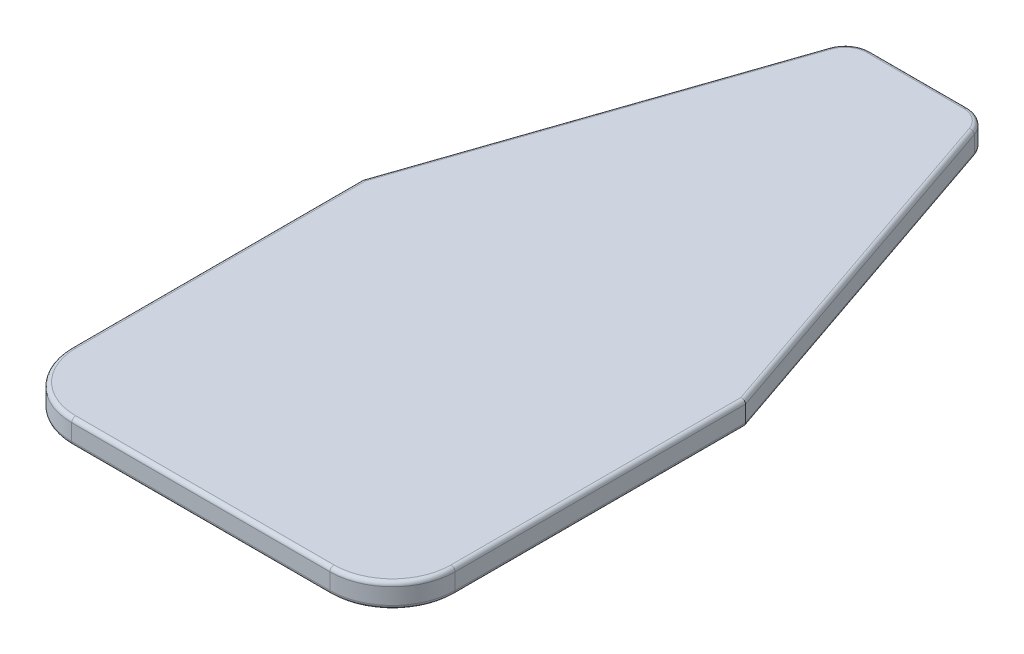
ISO-10303-21;
HEADER;
FILE_DESCRIPTION(('STEP AP214'),'2;1');
FILE_NAME('part.step','',(''),(''),'','','');
FILE_SCHEMA(('AUTOMOTIVE_DESIGN { 1 0 10303 214 1 1 1 1 }'));
ENDSEC;
DATA;
#1=APPLICATION_CONTEXT('core data for automotive mechanical design processes');
#2=APPLICATION_PROTOCOL_DEFINITION('international standard','automotive_design',2000,#1);
#3=PRODUCT_CONTEXT('',#1,'mechanical');
#4=PRODUCT('Part','Part','',(#3));
#5=PRODUCT_RELATED_PRODUCT_CATEGORY('part','',(#4));
#6=PRODUCT_DEFINITION_FORMATION('','',#4);
#7=PRODUCT_DEFINITION_CONTEXT('part definition',#1,'design');
#8=PRODUCT_DEFINITION('design','',#6,#7);
#9=PRODUCT_DEFINITION_SHAPE('','',#8);
#10=(LENGTH_UNIT() NAMED_UNIT(*) SI_UNIT(.MILLI.,.METRE.));
#11=(NAMED_UNIT(*) PLANE_ANGLE_UNIT() SI_UNIT($,.RADIAN.));
#12=(NAMED_UNIT(*) SI_UNIT($,.STERADIAN.) SOLID_ANGLE_UNIT());
#13=UNCERTAINTY_MEASURE_WITH_UNIT(LENGTH_MEASURE(1.E-05),#10,'distance_accuracy_value','');
#14=(GEOMETRIC_REPRESENTATION_CONTEXT(3) GLOBAL_UNCERTAINTY_ASSIGNED_CONTEXT((#13)) GLOBAL_UNIT_ASSIGNED_CONTEXT((#10,
#11,#12)) REPRESENTATION_CONTEXT('',''));
#15=CARTESIAN_POINT('',(0.,0.,0.));
#16=DIRECTION('',(0.,0.,1.));
#17=DIRECTION('',(1.,0.,0.));
#18=AXIS2_PLACEMENT_3D('',#15,#16,#17);
#19=CARTESIAN_POINT('',(-101.6,19.05,-24.8480219094121));
#20=DIRECTION('',(0.,-1.,0.));
#21=DIRECTION('',(0.,0.,-1.));
#22=AXIS2_PLACEMENT_3D('',#19,#20,#21);
#23=CYLINDRICAL_SURFACE('',#22,49.2125);
#24=DIRECTION('',(0.,-1.,0.));
#25=VECTOR('',#24,1.);
#26=CARTESIAN_POINT('',(-150.8125,19.05,-24.8480219094121));
#27=LINE('',#26,#25);
#28=CARTESIAN_POINT('',(-150.8125,15.875,-24.8480219094121));
#29=VERTEX_POINT('',#28);
#30=CARTESIAN_POINT('',(-150.8125,3.17500000000001,-24.8480219094121));
#31=VERTEX_POINT('',#30);
#32=EDGE_CURVE('E206',#29,#31,#27,.T.);
#33=ORIENTED_EDGE('',*,*,#32,.T.);
#34=CARTESIAN_POINT('',(-101.6,3.175,-24.8480219094121));
#35=DIRECTION('',(0.,1.,0.));
#36=DIRECTION('',(0.,0.,1.));
#37=AXIS2_PLACEMENT_3D('',#34,#35,#36);
#38=CIRCLE('',#37,49.2125);
#39=CARTESIAN_POINT('',(-101.6,3.17500000000001,24.3644780905879));
#40=VERTEX_POINT('',#39);
#41=EDGE_CURVE('E246',#31,#40,#38,.T.);
#42=ORIENTED_EDGE('',*,*,#41,.T.);
#43=DIRECTION('',(0.,-1.,0.));
#44=VECTOR('',#43,1.);
#45=CARTESIAN_POINT('',(-101.6,19.05,24.3644780905879));
#46=LINE('',#45,#44);
#47=CARTESIAN_POINT('',(-101.6,15.875,24.3644780905879));
#48=VERTEX_POINT('',#47);
#49=EDGE_CURVE('E200',#48,#40,#46,.T.);
#50=ORIENTED_EDGE('',*,*,#49,.F.);
#51=CARTESIAN_POINT('',(-101.6,15.875,-24.8480219094121));
#52=DIRECTION('',(0.,1.,0.));
#53=DIRECTION('',(0.,0.,1.));
#54=AXIS2_PLACEMENT_3D('',#51,#52,#53);
#55=CIRCLE('',#54,49.2125);
#56=EDGE_CURVE('E314',#48,#29,#55,.F.);
#57=ORIENTED_EDGE('',*,*,#56,.T.);
#58=EDGE_LOOP('',(#33,#42,#50,#57));
#59=FACE_BOUND('',#58,.T.);
#60=ADVANCED_FACE('F39',(#59),#23,.T.);
#61=CARTESIAN_POINT('',(-101.6,19.05,24.3644780905879));
#62=DIRECTION('',(0.,0.,-1.));
#63=DIRECTION('',(-1.,0.,0.));
#64=AXIS2_PLACEMENT_3D('',#61,#62,#63);
#65=PLANE('',#64);
#66=ORIENTED_EDGE('',*,*,#49,.T.);
#67=DIRECTION('',(1.,0.,0.));
#68=VECTOR('',#67,1.);
#69=CARTESIAN_POINT('',(-101.6,3.175,24.3644780905879));
#70=LINE('',#69,#68);
#71=CARTESIAN_POINT('',(101.6,3.17500000000001,24.3644780905879));
#72=VERTEX_POINT('',#71);
#73=EDGE_CURVE('E11',#40,#72,#70,.T.);
#74=ORIENTED_EDGE('',*,*,#73,.T.);
#75=DIRECTION('',(0.,-1.,0.));
#76=VECTOR('',#75,1.);
#77=CARTESIAN_POINT('',(101.6,19.05,24.3644780905879));
#78=LINE('',#77,#76);
#79=CARTESIAN_POINT('',(101.6,15.875,24.3644780905879));
#80=VERTEX_POINT('',#79);
#81=EDGE_CURVE('E332',#80,#72,#78,.T.);
#82=ORIENTED_EDGE('',*,*,#81,.F.);
#83=DIRECTION('',(1.,0.,0.));
#84=VECTOR('',#83,1.);
#85=CARTESIAN_POINT('',(-101.6,15.875,24.3644780905879));
#86=LINE('',#85,#84);
#87=EDGE_CURVE('E311',#80,#48,#86,.F.);
#88=ORIENTED_EDGE('',*,*,#87,.T.);
#89=EDGE_LOOP('',(#66,#74,#82,#88));
#90=FACE_BOUND('',#89,.T.);
#91=ADVANCED_FACE('F429',(#90),#65,.F.);
#92=CARTESIAN_POINT('',(101.6,19.05,-24.8480219094121));
#93=DIRECTION('',(0.,-1.,0.));
#94=DIRECTION('',(0.,0.,-1.));
#95=AXIS2_PLACEMENT_3D('',#92,#93,#94);
#96=CYLINDRICAL_SURFACE('',#95,49.2125);
#97=ORIENTED_EDGE('',*,*,#81,.T.);
#98=CARTESIAN_POINT('',(101.6,3.175,-24.8480219094121));
#99=DIRECTION('',(0.,1.,0.));
#100=DIRECTION('',(0.,0.,1.));
#101=AXIS2_PLACEMENT_3D('',#98,#99,#100);
#102=CIRCLE('',#101,49.2125);
#103=CARTESIAN_POINT('',(150.8125,3.17500000000001,-24.8480219094121));
#104=VERTEX_POINT('',#103);
#105=EDGE_CURVE('E61',#72,#104,#102,.T.);
#106=ORIENTED_EDGE('',*,*,#105,.T.);
#107=DIRECTION('',(0.,-1.,0.));
#108=VECTOR('',#107,1.);
#109=CARTESIAN_POINT('',(150.8125,19.05,-24.8480219094121));
#110=LINE('',#109,#108);
#111=CARTESIAN_POINT('',(150.8125,15.875,-24.8480219094121));
#112=VERTEX_POINT('',#111);
#113=EDGE_CURVE('E328',#112,#104,#110,.T.);
#114=ORIENTED_EDGE('',*,*,#113,.F.);
#115=CARTESIAN_POINT('',(101.6,15.875,-24.8480219094121));
#116=DIRECTION('',(0.,1.,0.));
#117=DIRECTION('',(0.,0.,1.));
#118=AXIS2_PLACEMENT_3D('',#115,#116,#117);
#119=CIRCLE('',#118,49.2125);
#120=EDGE_CURVE('E203',#112,#80,#119,.F.);
#121=ORIENTED_EDGE('',*,*,#120,.T.);
#122=EDGE_LOOP('',(#97,#106,#114,#121));
#123=FACE_BOUND('',#122,.T.);
#124=ADVANCED_FACE('F331',(#123),#96,.T.);
#125=CARTESIAN_POINT('',(150.8125,19.05,-24.8480219094121));
#126=DIRECTION('',(-1.,0.,0.));
#127=DIRECTION('',(0.,0.,1.));
#128=AXIS2_PLACEMENT_3D('',#125,#126,#127);
#129=PLANE('',#128);
#130=ORIENTED_EDGE('',*,*,#113,.T.);
#131=DIRECTION('',(0.,0.,-1.));
#132=VECTOR('',#131,1.);
#133=CARTESIAN_POINT('',(150.8125,3.175,-24.8480219094121));
#134=LINE('',#133,#132);
#135=CARTESIAN_POINT('',(150.8125,3.17500000000001,-253.448021909412));
#136=VERTEX_POINT('',#135);
#137=EDGE_CURVE('E248',#104,#136,#134,.T.);
#138=ORIENTED_EDGE('',*,*,#137,.T.);
#139=DIRECTION('',(0.,-1.,0.));
#140=VECTOR('',#139,1.);
#141=CARTESIAN_POINT('',(150.8125,19.05,-253.448021909412));
#142=LINE('',#141,#140);
#143=CARTESIAN_POINT('',(150.8125,15.875,-253.448021909412));
#144=VERTEX_POINT('',#143);
#145=EDGE_CURVE('E330',#144,#136,#142,.T.);
#146=ORIENTED_EDGE('',*,*,#145,.F.);
#147=DIRECTION('',(0.,0.,-1.));
#148=VECTOR('',#147,1.);
#149=CARTESIAN_POINT('',(150.8125,15.875,-24.8480219094121));
#150=LINE('',#149,#148);
#151=EDGE_CURVE('E217',#144,#112,#150,.F.);
#152=ORIENTED_EDGE('',*,*,#151,.T.);
#153=EDGE_LOOP('',(#130,#138,#146,#152));
#154=FACE_BOUND('',#153,.T.);
#155=ADVANCED_FACE('F327',(#154),#129,.F.);
#156=CARTESIAN_POINT('',(150.8125,19.05,-253.448021909412));
#157=DIRECTION('',(-0.946141878412051,0.,0.323752290980182));
#158=DIRECTION('',(0.323752290980182,0.,0.946141878412051));
#159=AXIS2_PLACEMENT_3D('',#156,#157,#158);
#160=PLANE('',#159);
#161=ORIENTED_EDGE('',*,*,#145,.T.);
#162=DIRECTION('',(-0.323752290980182,0.,-0.946141878412051));
#163=VECTOR('',#162,1.);
#164=CARTESIAN_POINT('',(150.8125,3.175,-253.448021909412));
#165=LINE('',#164,#163);
#166=CARTESIAN_POINT('',(57.15,3.17500000000001,-527.169679348412));
#167=VERTEX_POINT('',#166);
#168=EDGE_CURVE('E213',#136,#167,#165,.T.);
#169=ORIENTED_EDGE('',*,*,#168,.T.);
#170=DIRECTION('',(0.,-1.,0.));
#171=VECTOR('',#170,1.);
#172=CARTESIAN_POINT('',(57.15,19.05,-527.169679348412));
#173=LINE('',#172,#171);
#174=CARTESIAN_POINT('',(57.15,15.875,-527.169679348412));
#175=VERTEX_POINT('',#174);
#176=EDGE_CURVE('E335',#175,#167,#173,.T.);
#177=ORIENTED_EDGE('',*,*,#176,.F.);
#178=DIRECTION('',(-0.323752290980182,0.,-0.946141878412051));
#179=VECTOR('',#178,1.);
#180=CARTESIAN_POINT('',(150.8125,15.875,-253.448021909412));
#181=LINE('',#180,#179);
#182=EDGE_CURVE('E316',#175,#144,#181,.F.);
#183=ORIENTED_EDGE('',*,*,#182,.T.);
#184=EDGE_LOOP('',(#161,#169,#177,#183));
#185=FACE_BOUND('',#184,.T.);
#186=ADVANCED_FACE('F415',(#185),#160,.F.);
#187=CARTESIAN_POINT('',(38.1,19.05,-520.651120891277));
#188=DIRECTION('',(0.,-1.,0.));
#189=DIRECTION('',(0.,0.,-1.));
#190=AXIS2_PLACEMENT_3D('',#187,#188,#189);
#191=CYLINDRICAL_SURFACE('',#190,20.1344010181353);
#192=ORIENTED_EDGE('',*,*,#176,.T.);
#193=CARTESIAN_POINT('',(38.1,3.175,-520.651120891277));
#194=DIRECTION('',(0.,1.,0.));
#195=DIRECTION('',(0.,0.,1.));
#196=AXIS2_PLACEMENT_3D('',#193,#194,#195);
#197=CIRCLE('',#196,20.1344010181353);
#198=CARTESIAN_POINT('',(38.1,3.17500000000001,-540.785521909412));
#199=VERTEX_POINT('',#198);
#200=EDGE_CURVE('E238',#167,#199,#197,.T.);
#201=ORIENTED_EDGE('',*,*,#200,.T.);
#202=DIRECTION('',(0.,-1.,0.));
#203=VECTOR('',#202,1.);
#204=CARTESIAN_POINT('',(38.1,19.05,-540.785521909412));
#205=LINE('',#204,#203);
#206=CARTESIAN_POINT('',(38.1,15.875,-540.785521909412));
#207=VERTEX_POINT('',#206);
#208=EDGE_CURVE('E402',#207,#199,#205,.T.);
#209=ORIENTED_EDGE('',*,*,#208,.F.);
#210=CARTESIAN_POINT('',(38.1,15.875,-520.651120891277));
#211=DIRECTION('',(0.,1.,0.));
#212=DIRECTION('',(0.,0.,1.));
#213=AXIS2_PLACEMENT_3D('',#210,#211,#212);
#214=CIRCLE('',#213,20.1344010181353);
#215=EDGE_CURVE('E362',#207,#175,#214,.F.);
#216=ORIENTED_EDGE('',*,*,#215,.T.);
#217=EDGE_LOOP('',(#192,#201,#209,#216));
#218=FACE_BOUND('',#217,.T.);
#219=ADVANCED_FACE('F414',(#218),#191,.T.);
#220=CARTESIAN_POINT('',(-38.1,19.05,-540.785521909412));
#221=DIRECTION('',(0.,0.,1.));
#222=DIRECTION('',(1.,0.,0.));
#223=AXIS2_PLACEMENT_3D('',#220,#221,#222);
#224=PLANE('',#223);
#225=ORIENTED_EDGE('',*,*,#208,.T.);
#226=DIRECTION('',(-1.,0.,0.));
#227=VECTOR('',#226,1.);
#228=CARTESIAN_POINT('',(-38.1,3.175,-540.785521909412));
#229=LINE('',#228,#227);
#230=CARTESIAN_POINT('',(-38.1,3.17500000000001,-540.785521909412));
#231=VERTEX_POINT('',#230);
#232=EDGE_CURVE('E240',#199,#231,#229,.T.);
#233=ORIENTED_EDGE('',*,*,#232,.T.);
#234=DIRECTION('',(0.,-1.,0.));
#235=VECTOR('',#234,1.);
#236=CARTESIAN_POINT('',(-38.1,19.05,-540.785521909412));
#237=LINE('',#236,#235);
#238=CARTESIAN_POINT('',(-38.1,15.875,-540.785521909412));
#239=VERTEX_POINT('',#238);
#240=EDGE_CURVE('E394',#239,#231,#237,.T.);
#241=ORIENTED_EDGE('',*,*,#240,.F.);
#242=DIRECTION('',(-1.,0.,0.));
#243=VECTOR('',#242,1.);
#244=CARTESIAN_POINT('',(38.1,15.875,-540.785521909412));
#245=LINE('',#244,#243);
#246=EDGE_CURVE('E360',#239,#207,#245,.F.);
#247=ORIENTED_EDGE('',*,*,#246,.T.);
#248=EDGE_LOOP('',(#225,#233,#241,#247));
#249=FACE_BOUND('',#248,.T.);
#250=ADVANCED_FACE('F399',(#249),#224,.F.);
#251=CARTESIAN_POINT('',(-38.1,19.05,-520.651120891277));
#252=DIRECTION('',(0.,-1.,0.));
#253=DIRECTION('',(0.,0.,-1.));
#254=AXIS2_PLACEMENT_3D('',#251,#252,#253);
#255=CYLINDRICAL_SURFACE('',#254,20.1344010181353);
#256=ORIENTED_EDGE('',*,*,#240,.T.);
#257=CARTESIAN_POINT('',(-38.1,3.175,-520.651120891277));
#258=DIRECTION('',(0.,1.,0.));
#259=DIRECTION('',(0.,0.,1.));
#260=AXIS2_PLACEMENT_3D('',#257,#258,#259);
#261=CIRCLE('',#260,20.1344010181353);
#262=CARTESIAN_POINT('',(-57.15,3.17500000000001,-527.169679348412));
#263=VERTEX_POINT('',#262);
#264=EDGE_CURVE('E242',#231,#263,#261,.T.);
#265=ORIENTED_EDGE('',*,*,#264,.T.);
#266=DIRECTION('',(0.,-1.,0.));
#267=VECTOR('',#266,1.);
#268=CARTESIAN_POINT('',(-57.15,19.05,-527.169679348412));
#269=LINE('',#268,#267);
#270=CARTESIAN_POINT('',(-57.15,15.875,-527.169679348412));
#271=VERTEX_POINT('',#270);
#272=EDGE_CURVE('E378',#271,#263,#269,.T.);
#273=ORIENTED_EDGE('',*,*,#272,.F.);
#274=CARTESIAN_POINT('',(-38.1,15.875,-520.651120891277));
#275=DIRECTION('',(0.,1.,0.));
#276=DIRECTION('',(0.,0.,1.));
#277=AXIS2_PLACEMENT_3D('',#274,#275,#276);
#278=CIRCLE('',#277,20.1344010181353);
#279=EDGE_CURVE('E358',#271,#239,#278,.F.);
#280=ORIENTED_EDGE('',*,*,#279,.T.);
#281=EDGE_LOOP('',(#256,#265,#273,#280));
#282=FACE_BOUND('',#281,.T.);
#283=ADVANCED_FACE('F393',(#282),#255,.T.);
#284=CARTESIAN_POINT('',(-150.8125,19.05,-253.448021909412));
#285=DIRECTION('',(0.946141878412051,0.,0.323752290980182));
#286=DIRECTION('',(0.323752290980182,0.,-0.946141878412051));
#287=AXIS2_PLACEMENT_3D('',#284,#285,#286);
#288=PLANE('',#287);
#289=ORIENTED_EDGE('',*,*,#272,.T.);
#290=DIRECTION('',(-0.323752290980182,0.,0.946141878412051));
#291=VECTOR('',#290,1.);
#292=CARTESIAN_POINT('',(-150.8125,3.175,-253.448021909412));
#293=LINE('',#292,#291);
#294=CARTESIAN_POINT('',(-150.8125,3.17500000000001,-253.448021909412));
#295=VERTEX_POINT('',#294);
#296=EDGE_CURVE('E48',#263,#295,#293,.T.);
#297=ORIENTED_EDGE('',*,*,#296,.T.);
#298=DIRECTION('',(0.,-1.,0.));
#299=VECTOR('',#298,1.);
#300=CARTESIAN_POINT('',(-150.8125,19.05,-253.448021909412));
#301=LINE('',#300,#299);
#302=CARTESIAN_POINT('',(-150.8125,15.875,-253.448021909412));
#303=VERTEX_POINT('',#302);
#304=EDGE_CURVE('E369',#303,#295,#301,.T.);
#305=ORIENTED_EDGE('',*,*,#304,.F.);
#306=DIRECTION('',(-0.323752290980182,0.,0.946141878412051));
#307=VECTOR('',#306,1.);
#308=CARTESIAN_POINT('',(-57.15,15.875,-527.169679348412));
#309=LINE('',#308,#307);
#310=EDGE_CURVE('E355',#303,#271,#309,.F.);
#311=ORIENTED_EDGE('',*,*,#310,.T.);
#312=EDGE_LOOP('',(#289,#297,#305,#311));
#313=FACE_BOUND('',#312,.T.);
#314=ADVANCED_FACE('F376',(#313),#288,.F.);
#315=CARTESIAN_POINT('',(-150.8125,19.05,-24.8480219094121));
#316=DIRECTION('',(1.,0.,0.));
#317=DIRECTION('',(0.,0.,-1.));
#318=AXIS2_PLACEMENT_3D('',#315,#316,#317);
#319=PLANE('',#318);
#320=ORIENTED_EDGE('',*,*,#304,.T.);
#321=DIRECTION('',(0.,0.,1.));
#322=VECTOR('',#321,1.);
#323=CARTESIAN_POINT('',(-150.8125,3.175,-24.8480219094121));
#324=LINE('',#323,#322);
#325=EDGE_CURVE('E244',#295,#31,#324,.T.);
#326=ORIENTED_EDGE('',*,*,#325,.T.);
#327=ORIENTED_EDGE('',*,*,#32,.F.);
#328=DIRECTION('',(0.,0.,1.));
#329=VECTOR('',#328,1.);
#330=CARTESIAN_POINT('',(-150.8125,15.875,-253.448021909412));
#331=LINE('',#330,#329);
#332=EDGE_CURVE('E318',#29,#303,#331,.F.);
#333=ORIENTED_EDGE('',*,*,#332,.T.);
#334=EDGE_LOOP('',(#320,#326,#327,#333));
#335=FACE_BOUND('',#334,.T.);
#336=ADVANCED_FACE('F368',(#335),#319,.F.);
#337=CARTESIAN_POINT('',(-101.6,19.05,-24.8480219094121));
#338=DIRECTION('',(0.,1.,0.));
#339=DIRECTION('',(0.,0.,1.));
#340=AXIS2_PLACEMENT_3D('',#337,#338,#339);
#341=PLANE('',#340);
#342=CARTESIAN_POINT('',(-38.1,19.05,-520.651120891277));
#343=DIRECTION('',(0.,1.,0.));
#344=DIRECTION('',(0.,0.,1.));
#345=AXIS2_PLACEMENT_3D('',#342,#343,#344);
#346=CIRCLE('',#345,16.9594010181352);
#347=CARTESIAN_POINT('',(-38.1,19.05,-537.610521909412));
#348=VERTEX_POINT('',#347);
#349=CARTESIAN_POINT('',(-54.1459995360417,19.05,-526.14176582455));
#350=VERTEX_POINT('',#349);
#351=EDGE_CURVE('E350',#348,#350,#346,.T.);
#352=ORIENTED_EDGE('',*,*,#351,.T.);
#353=DIRECTION('',(-0.323752290980182,0.,0.946141878412051));
#354=VECTOR('',#353,1.);
#355=CARTESIAN_POINT('',(-147.808499536042,19.05,-252.42010838555));
#356=LINE('',#355,#354);
#357=CARTESIAN_POINT('',(-147.6375,19.05,-252.919841751909));
#358=VERTEX_POINT('',#357);
#359=EDGE_CURVE('E352',#350,#358,#356,.T.);
#360=ORIENTED_EDGE('',*,*,#359,.T.);
#361=DIRECTION('',(0.,0.,1.));
#362=VECTOR('',#361,1.);
#363=CARTESIAN_POINT('',(-147.6375,19.05,-24.8480219094121));
#364=LINE('',#363,#362);
#365=CARTESIAN_POINT('',(-147.6375,19.05,-24.8480219094121));
#366=VERTEX_POINT('',#365);
#367=EDGE_CURVE('E344',#358,#366,#364,.T.);
#368=ORIENTED_EDGE('',*,*,#367,.T.);
#369=CARTESIAN_POINT('',(-101.6,19.05,-24.8480219094121));
#370=DIRECTION('',(0.,1.,0.));
#371=DIRECTION('',(0.,0.,1.));
#372=AXIS2_PLACEMENT_3D('',#369,#370,#371);
#373=CIRCLE('',#372,46.0375);
#374=CARTESIAN_POINT('',(-101.6,19.05,21.1894780905879));
#375=VERTEX_POINT('',#374);
#376=EDGE_CURVE('E342',#366,#375,#373,.T.);
#377=ORIENTED_EDGE('',*,*,#376,.T.);
#378=DIRECTION('',(1.,0.,0.));
#379=VECTOR('',#378,1.);
#380=CARTESIAN_POINT('',(101.6,19.05,21.1894780905879));
#381=LINE('',#380,#379);
#382=CARTESIAN_POINT('',(101.6,19.05,21.1894780905879));
#383=VERTEX_POINT('',#382);
#384=EDGE_CURVE('E184',#375,#383,#381,.T.);
#385=ORIENTED_EDGE('',*,*,#384,.T.);
#386=CARTESIAN_POINT('',(101.6,19.05,-24.8480219094121));
#387=DIRECTION('',(0.,1.,0.));
#388=DIRECTION('',(0.,0.,1.));
#389=AXIS2_PLACEMENT_3D('',#386,#387,#388);
#390=CIRCLE('',#389,46.0375);
#391=CARTESIAN_POINT('',(147.6375,19.05,-24.8480219094121));
#392=VERTEX_POINT('',#391);
#393=EDGE_CURVE('E178',#383,#392,#390,.T.);
#394=ORIENTED_EDGE('',*,*,#393,.T.);
#395=DIRECTION('',(0.,0.,-1.));
#396=VECTOR('',#395,1.);
#397=CARTESIAN_POINT('',(147.6375,19.05,-253.448021909412));
#398=LINE('',#397,#396);
#399=CARTESIAN_POINT('',(147.6375,19.05,-252.91984175191));
#400=VERTEX_POINT('',#399);
#401=EDGE_CURVE('E181',#392,#400,#398,.T.);
#402=ORIENTED_EDGE('',*,*,#401,.T.);
#403=DIRECTION('',(-0.323752290980182,0.,-0.946141878412051));
#404=VECTOR('',#403,1.);
#405=CARTESIAN_POINT('',(54.1459995360417,19.05,-526.14176582455));
#406=LINE('',#405,#404);
#407=CARTESIAN_POINT('',(54.1459995360418,19.05,-526.14176582455));
#408=VERTEX_POINT('',#407);
#409=EDGE_CURVE('E189',#400,#408,#406,.T.);
#410=ORIENTED_EDGE('',*,*,#409,.T.);
#411=CARTESIAN_POINT('',(38.1,19.05,-520.651120891277));
#412=DIRECTION('',(0.,1.,0.));
#413=DIRECTION('',(0.,0.,1.));
#414=AXIS2_PLACEMENT_3D('',#411,#412,#413);
#415=CIRCLE('',#414,16.9594010181352);
#416=CARTESIAN_POINT('',(38.1,19.05,-537.610521909412));
#417=VERTEX_POINT('',#416);
#418=EDGE_CURVE('E346',#408,#417,#415,.T.);
#419=ORIENTED_EDGE('',*,*,#418,.T.);
#420=DIRECTION('',(-1.,0.,0.));
#421=VECTOR('',#420,1.);
#422=CARTESIAN_POINT('',(-38.1,19.05,-537.610521909412));
#423=LINE('',#422,#421);
#424=EDGE_CURVE('E348',#417,#348,#423,.T.);
#425=ORIENTED_EDGE('',*,*,#424,.T.);
#426=EDGE_LOOP('',(#352,#360,#368,#377,#385,#394,#402,#410,#419,#425));
#427=FACE_BOUND('',#426,.T.);
#428=ADVANCED_FACE('F180',(#427),#341,.T.);
#429=CARTESIAN_POINT('',(-101.6,0.,-24.8480219094121));
#430=DIRECTION('',(0.,1.,0.));
#431=DIRECTION('',(0.,0.,1.));
#432=AXIS2_PLACEMENT_3D('',#429,#430,#431);
#433=PLANE('',#432);
#434=DIRECTION('',(-1.,0.,0.));
#435=VECTOR('',#434,1.);
#436=CARTESIAN_POINT('',(-101.6,0.,-537.610521909412));
#437=LINE('',#436,#435);
#438=CARTESIAN_POINT('',(-38.1,0.,-537.610521909412));
#439=VERTEX_POINT('',#438);
#440=CARTESIAN_POINT('',(38.1,0.,-537.610521909412));
#441=VERTEX_POINT('',#440);
#442=EDGE_CURVE('E234',#439,#441,#437,.F.);
#443=ORIENTED_EDGE('',*,*,#442,.T.);
#444=CARTESIAN_POINT('',(38.1,0.,-520.651120891277));
#445=DIRECTION('',(0.,1.,0.));
#446=DIRECTION('',(0.,0.,1.));
#447=AXIS2_PLACEMENT_3D('',#444,#445,#446);
#448=CIRCLE('',#447,16.9594010181352);
#449=CARTESIAN_POINT('',(54.1459995360417,0.,-526.14176582455));
#450=VERTEX_POINT('',#449);
#451=EDGE_CURVE('E236',#441,#450,#448,.F.);
#452=ORIENTED_EDGE('',*,*,#451,.T.);
#453=DIRECTION('',(-0.323752290980182,0.,-0.946141878412051));
#454=VECTOR('',#453,1.);
#455=CARTESIAN_POINT('',(191.375491879258,0.,-125.098828750505));
#456=LINE('',#455,#454);
#457=CARTESIAN_POINT('',(147.6375,0.,-252.91984175191));
#458=VERTEX_POINT('',#457);
#459=EDGE_CURVE('E227',#450,#458,#456,.F.);
#460=ORIENTED_EDGE('',*,*,#459,.T.);
#461=DIRECTION('',(0.,0.,-1.));
#462=VECTOR('',#461,1.);
#463=CARTESIAN_POINT('',(147.6375,0.,-24.8480219094121));
#464=LINE('',#463,#462);
#465=CARTESIAN_POINT('',(147.6375,0.,-24.8480219094121));
#466=VERTEX_POINT('',#465);
#467=EDGE_CURVE('E221',#458,#466,#464,.F.);
#468=ORIENTED_EDGE('',*,*,#467,.T.);
#469=CARTESIAN_POINT('',(101.6,0.,-24.8480219094121));
#470=DIRECTION('',(0.,1.,0.));
#471=DIRECTION('',(0.,0.,1.));
#472=AXIS2_PLACEMENT_3D('',#469,#470,#471);
#473=CIRCLE('',#472,46.0375);
#474=CARTESIAN_POINT('',(101.6,0.,21.1894780905879));
#475=VERTEX_POINT('',#474);
#476=EDGE_CURVE('E219',#466,#475,#473,.F.);
#477=ORIENTED_EDGE('',*,*,#476,.T.);
#478=DIRECTION('',(1.,0.,0.));
#479=VECTOR('',#478,1.);
#480=CARTESIAN_POINT('',(-101.6,0.,21.1894780905879));
#481=LINE('',#480,#479);
#482=CARTESIAN_POINT('',(-101.6,0.,21.1894780905879));
#483=VERTEX_POINT('',#482);
#484=EDGE_CURVE('E216',#475,#483,#481,.F.);
#485=ORIENTED_EDGE('',*,*,#484,.T.);
#486=CARTESIAN_POINT('',(-101.6,0.,-24.8480219094121));
#487=DIRECTION('',(0.,1.,0.));
#488=DIRECTION('',(0.,0.,1.));
#489=AXIS2_PLACEMENT_3D('',#486,#487,#488);
#490=CIRCLE('',#489,46.0375);
#491=CARTESIAN_POINT('',(-147.6375,0.,-24.8480219094121));
#492=VERTEX_POINT('',#491);
#493=EDGE_CURVE('E223',#483,#492,#490,.F.);
#494=ORIENTED_EDGE('',*,*,#493,.T.);
#495=DIRECTION('',(0.,0.,1.));
#496=VECTOR('',#495,1.);
#497=CARTESIAN_POINT('',(-147.6375,0.,-24.8480219094121));
#498=LINE('',#497,#496);
#499=CARTESIAN_POINT('',(-147.6375,0.,-252.91984175191));
#500=VERTEX_POINT('',#499);
#501=EDGE_CURVE('E225',#492,#500,#498,.F.);
#502=ORIENTED_EDGE('',*,*,#501,.T.);
#503=DIRECTION('',(-0.323752290980182,0.,0.946141878412051));
#504=VECTOR('',#503,1.);
#505=CARTESIAN_POINT('',(-212.674010809169,0.,-62.8554986825361));
#506=LINE('',#505,#504);
#507=CARTESIAN_POINT('',(-54.1459995360418,0.,-526.14176582455));
#508=VERTEX_POINT('',#507);
#509=EDGE_CURVE('E230',#500,#508,#506,.F.);
#510=ORIENTED_EDGE('',*,*,#509,.T.);
#511=CARTESIAN_POINT('',(-38.1,0.,-520.651120891277));
#512=DIRECTION('',(0.,1.,0.));
#513=DIRECTION('',(0.,0.,1.));
#514=AXIS2_PLACEMENT_3D('',#511,#512,#513);
#515=CIRCLE('',#514,16.9594010181352);
#516=EDGE_CURVE('E232',#508,#439,#515,.F.);
#517=ORIENTED_EDGE('',*,*,#516,.T.);
#518=EDGE_LOOP('',(#443,#452,#460,#468,#477,#485,#494,#502,#510,#517));
#519=FACE_BOUND('',#518,.T.);
#520=ADVANCED_FACE('F426',(#519),#433,.F.);
#521=CARTESIAN_POINT('',(147.6375,15.875,-24.8480219094121));
#522=DIRECTION('',(0.,0.,1.));
#523=DIRECTION('',(1.,0.,0.));
#524=AXIS2_PLACEMENT_3D('',#521,#522,#523);
#525=CYLINDRICAL_SURFACE('',#524,3.175);
#526=CARTESIAN_POINT('',(147.6375,15.875,-24.8480219094121));
#527=DIRECTION('',(0.,0.,1.));
#528=DIRECTION('',(1.,0.,0.));
#529=AXIS2_PLACEMENT_3D('',#526,#527,#528);
#530=CIRCLE('',#529,3.175);
#531=EDGE_CURVE('E195',#112,#392,#530,.T.);
#532=ORIENTED_EDGE('',*,*,#531,.F.);
#533=ORIENTED_EDGE('',*,*,#151,.F.);
#534=CARTESIAN_POINT('',(147.6375,15.875,-252.91984175191));
#535=DIRECTION('',(0.164100764148052,0.,0.986443581359839));
#536=DIRECTION('',(-0.986443581359839,0.,0.164100764148052));
#537=AXIS2_PLACEMENT_3D('',#534,#535,#536);
#538=ELLIPSE('',#537,3.2186331382715,3.175);
#539=EDGE_CURVE('E198',#400,#144,#538,.F.);
#540=ORIENTED_EDGE('',*,*,#539,.F.);
#541=ORIENTED_EDGE('',*,*,#401,.F.);
#542=EDGE_LOOP('',(#532,#533,#540,#541));
#543=FACE_BOUND('',#542,.T.);
#544=ADVANCED_FACE('F193',(#543),#525,.T.);
#545=CARTESIAN_POINT('',(191.375491879258,15.875,-125.098828750505));
#546=DIRECTION('',(0.323752290980182,0.,0.946141878412051));
#547=DIRECTION('',(0.946141878412051,0.,-0.323752290980182));
#548=AXIS2_PLACEMENT_3D('',#545,#546,#547);
#549=CYLINDRICAL_SURFACE('',#548,3.175);
#550=ORIENTED_EDGE('',*,*,#539,.T.);
#551=ORIENTED_EDGE('',*,*,#182,.F.);
#552=CARTESIAN_POINT('',(54.1459995360418,15.875,-526.14176582455));
#553=DIRECTION('',(-0.323752290980197,0.,-0.946141878412046));
#554=DIRECTION('',(-0.946141878412046,0.,0.323752290980197));
#555=AXIS2_PLACEMENT_3D('',#552,#553,#554);
#556=CIRCLE('',#555,3.175);
#557=EDGE_CURVE('E204',#408,#175,#556,.T.);
#558=ORIENTED_EDGE('',*,*,#557,.F.);
#559=ORIENTED_EDGE('',*,*,#409,.F.);
#560=EDGE_LOOP('',(#550,#551,#558,#559));
#561=FACE_BOUND('',#560,.T.);
#562=ADVANCED_FACE('F418',(#561),#549,.T.);
#563=CARTESIAN_POINT('',(101.6,15.875,-24.8480219094121));
#564=DIRECTION('',(0.,1.,0.));
#565=DIRECTION('',(0.,0.,1.));
#566=AXIS2_PLACEMENT_3D('',#563,#564,#565);
#567=TOROIDAL_SURFACE('',#566,46.0375,3.175);
#568=ORIENTED_EDGE('',*,*,#531,.T.);
#569=ORIENTED_EDGE('',*,*,#393,.F.);
#570=CARTESIAN_POINT('',(101.6,15.875,21.1894780905879));
#571=DIRECTION('',(-1.,0.,0.));
#572=DIRECTION('',(0.,0.,1.));
#573=AXIS2_PLACEMENT_3D('',#570,#571,#572);
#574=CIRCLE('',#573,3.175);
#575=EDGE_CURVE('E209',#80,#383,#574,.T.);
#576=ORIENTED_EDGE('',*,*,#575,.F.);
#577=ORIENTED_EDGE('',*,*,#120,.F.);
#578=EDGE_LOOP('',(#568,#569,#576,#577));
#579=FACE_BOUND('',#578,.T.);
#580=ADVANCED_FACE('F202',(#579),#567,.T.);
#581=CARTESIAN_POINT('',(38.1,15.875,-520.651120891277));
#582=DIRECTION('',(0.,1.,0.));
#583=DIRECTION('',(0.,0.,1.));
#584=AXIS2_PLACEMENT_3D('',#581,#582,#583);
#585=TOROIDAL_SURFACE('',#584,16.9594010181352,3.175);
#586=ORIENTED_EDGE('',*,*,#557,.T.);
#587=ORIENTED_EDGE('',*,*,#215,.F.);
#588=CARTESIAN_POINT('',(38.1,15.875,-537.610521909412));
#589=DIRECTION('',(-1.,0.,0.));
#590=DIRECTION('',(0.,0.,1.));
#591=AXIS2_PLACEMENT_3D('',#588,#589,#590);
#592=CIRCLE('',#591,3.175);
#593=EDGE_CURVE('E305',#417,#207,#592,.T.);
#594=ORIENTED_EDGE('',*,*,#593,.F.);
#595=ORIENTED_EDGE('',*,*,#418,.F.);
#596=EDGE_LOOP('',(#586,#587,#594,#595));
#597=FACE_BOUND('',#596,.T.);
#598=ADVANCED_FACE('F410',(#597),#585,.T.);
#599=CARTESIAN_POINT('',(-101.6,15.875,21.1894780905879));
#600=DIRECTION('',(-1.,0.,0.));
#601=DIRECTION('',(0.,0.,1.));
#602=AXIS2_PLACEMENT_3D('',#599,#600,#601);
#603=CYLINDRICAL_SURFACE('',#602,3.175);
#604=ORIENTED_EDGE('',*,*,#575,.T.);
#605=ORIENTED_EDGE('',*,*,#384,.F.);
#606=CARTESIAN_POINT('',(-101.6,15.875,21.1894780905879));
#607=DIRECTION('',(-1.,0.,0.));
#608=DIRECTION('',(0.,0.,1.));
#609=AXIS2_PLACEMENT_3D('',#606,#607,#608);
#610=CIRCLE('',#609,3.175);
#611=EDGE_CURVE('E302',#48,#375,#610,.T.);
#612=ORIENTED_EDGE('',*,*,#611,.F.);
#613=ORIENTED_EDGE('',*,*,#87,.F.);
#614=EDGE_LOOP('',(#604,#605,#612,#613));
#615=FACE_BOUND('',#614,.T.);
#616=ADVANCED_FACE('F309',(#615),#603,.T.);
#617=CARTESIAN_POINT('',(-101.6,15.875,-537.610521909412));
#618=DIRECTION('',(1.,0.,0.));
#619=DIRECTION('',(0.,0.,-1.));
#620=AXIS2_PLACEMENT_3D('',#617,#618,#619);
#621=CYLINDRICAL_SURFACE('',#620,3.175);
#622=ORIENTED_EDGE('',*,*,#593,.T.);
#623=ORIENTED_EDGE('',*,*,#246,.F.);
#624=CARTESIAN_POINT('',(-38.1,15.875,-537.610521909412));
#625=DIRECTION('',(-1.,0.,0.));
#626=DIRECTION('',(0.,0.,1.));
#627=AXIS2_PLACEMENT_3D('',#624,#625,#626);
#628=CIRCLE('',#627,3.175);
#629=EDGE_CURVE('E299',#348,#239,#628,.T.);
#630=ORIENTED_EDGE('',*,*,#629,.F.);
#631=ORIENTED_EDGE('',*,*,#424,.F.);
#632=EDGE_LOOP('',(#622,#623,#630,#631));
#633=FACE_BOUND('',#632,.T.);
#634=ADVANCED_FACE('F405',(#633),#621,.T.);
#635=CARTESIAN_POINT('',(-101.6,15.875,-24.8480219094121));
#636=DIRECTION('',(0.,1.,0.));
#637=DIRECTION('',(0.,0.,1.));
#638=AXIS2_PLACEMENT_3D('',#635,#636,#637);
#639=TOROIDAL_SURFACE('',#638,46.0375,3.175);
#640=ORIENTED_EDGE('',*,*,#611,.T.);
#641=ORIENTED_EDGE('',*,*,#376,.F.);
#642=CARTESIAN_POINT('',(-147.6375,15.875,-24.8480219094121));
#643=DIRECTION('',(0.,0.,-1.));
#644=DIRECTION('',(-1.,0.,0.));
#645=AXIS2_PLACEMENT_3D('',#642,#643,#644);
#646=CIRCLE('',#645,3.175);
#647=EDGE_CURVE('E292',#29,#366,#646,.T.);
#648=ORIENTED_EDGE('',*,*,#647,.F.);
#649=ORIENTED_EDGE('',*,*,#56,.F.);
#650=EDGE_LOOP('',(#640,#641,#648,#649));
#651=FACE_BOUND('',#650,.T.);
#652=ADVANCED_FACE('F444',(#651),#639,.T.);
#653=CARTESIAN_POINT('',(-38.1,15.875,-520.651120891277));
#654=DIRECTION('',(0.,1.,0.));
#655=DIRECTION('',(0.,0.,1.));
#656=AXIS2_PLACEMENT_3D('',#653,#654,#655);
#657=TOROIDAL_SURFACE('',#656,16.9594010181352,3.175);
#658=ORIENTED_EDGE('',*,*,#629,.T.);
#659=ORIENTED_EDGE('',*,*,#279,.F.);
#660=CARTESIAN_POINT('',(-54.1459995360417,15.875,-526.14176582455));
#661=DIRECTION('',(-0.323752290980192,0.,0.946141878412047));
#662=DIRECTION('',(0.946141878412047,0.,0.323752290980192));
#663=AXIS2_PLACEMENT_3D('',#660,#661,#662);
#664=CIRCLE('',#663,3.175);
#665=EDGE_CURVE('E285',#350,#271,#664,.T.);
#666=ORIENTED_EDGE('',*,*,#665,.F.);
#667=ORIENTED_EDGE('',*,*,#351,.F.);
#668=EDGE_LOOP('',(#658,#659,#666,#667));
#669=FACE_BOUND('',#668,.T.);
#670=ADVANCED_FACE('F389',(#669),#657,.T.);
#671=CARTESIAN_POINT('',(-147.6375,15.875,-24.8480219094121));
#672=DIRECTION('',(0.,0.,-1.));
#673=DIRECTION('',(-1.,0.,0.));
#674=AXIS2_PLACEMENT_3D('',#671,#672,#673);
#675=CYLINDRICAL_SURFACE('',#674,3.175);
#676=ORIENTED_EDGE('',*,*,#647,.T.);
#677=ORIENTED_EDGE('',*,*,#367,.F.);
#678=CARTESIAN_POINT('',(-147.6375,15.875,-252.919841751909));
#679=DIRECTION('',(0.164100764148052,0.,-0.986443581359839));
#680=DIRECTION('',(-0.986443581359839,0.,-0.164100764148052));
#681=AXIS2_PLACEMENT_3D('',#678,#679,#680);
#682=ELLIPSE('',#681,3.2186331382715,3.175);
#683=EDGE_CURVE('E280',#303,#358,#682,.T.);
#684=ORIENTED_EDGE('',*,*,#683,.F.);
#685=ORIENTED_EDGE('',*,*,#332,.F.);
#686=EDGE_LOOP('',(#676,#677,#684,#685));
#687=FACE_BOUND('',#686,.T.);
#688=ADVANCED_FACE('F383',(#687),#675,.T.);
#689=CARTESIAN_POINT('',(-212.674010809169,15.875,-62.8554986825361));
#690=DIRECTION('',(0.323752290980182,0.,-0.946141878412051));
#691=DIRECTION('',(-0.946141878412051,0.,-0.323752290980182));
#692=AXIS2_PLACEMENT_3D('',#689,#690,#691);
#693=CYLINDRICAL_SURFACE('',#692,3.175);
#694=ORIENTED_EDGE('',*,*,#665,.T.);
#695=ORIENTED_EDGE('',*,*,#310,.F.);
#696=ORIENTED_EDGE('',*,*,#683,.T.);
#697=ORIENTED_EDGE('',*,*,#359,.F.);
#698=EDGE_LOOP('',(#694,#695,#696,#697));
#699=FACE_BOUND('',#698,.T.);
#700=ADVANCED_FACE('F380',(#699),#693,.T.);
#701=CARTESIAN_POINT('',(-147.6375,3.175,-24.8480219094121));
#702=DIRECTION('',(0.,0.,1.));
#703=DIRECTION('',(1.,0.,0.));
#704=AXIS2_PLACEMENT_3D('',#701,#702,#703);
#705=CYLINDRICAL_SURFACE('',#704,3.175);
#706=CARTESIAN_POINT('',(-147.6375,3.175,-252.919841751909));
#707=DIRECTION('',(-0.164100764148052,0.,0.986443581359839));
#708=DIRECTION('',(-0.986443581359839,0.,-0.164100764148052));
#709=AXIS2_PLACEMENT_3D('',#706,#707,#708);
#710=ELLIPSE('',#709,3.2186331382715,3.175);
#711=EDGE_CURVE('E273',#500,#295,#710,.F.);
#712=ORIENTED_EDGE('',*,*,#711,.F.);
#713=ORIENTED_EDGE('',*,*,#501,.F.);
#714=CARTESIAN_POINT('',(-147.6375,3.175,-24.8480219094121));
#715=DIRECTION('',(0.,0.,1.));
#716=DIRECTION('',(1.,0.,0.));
#717=AXIS2_PLACEMENT_3D('',#714,#715,#716);
#718=CIRCLE('',#717,3.175);
#719=EDGE_CURVE('E43',#31,#492,#718,.T.);
#720=ORIENTED_EDGE('',*,*,#719,.F.);
#721=ORIENTED_EDGE('',*,*,#325,.F.);
#722=EDGE_LOOP('',(#712,#713,#720,#721));
#723=FACE_BOUND('',#722,.T.);
#724=ADVANCED_FACE('F41',(#723),#705,.T.);
#725=CARTESIAN_POINT('',(-101.6,3.175,-24.8480219094121));
#726=DIRECTION('',(0.,1.,0.));
#727=DIRECTION('',(0.,0.,1.));
#728=AXIS2_PLACEMENT_3D('',#725,#726,#727);
#729=TOROIDAL_SURFACE('',#728,46.0375,3.175);
#730=ORIENTED_EDGE('',*,*,#719,.T.);
#731=ORIENTED_EDGE('',*,*,#493,.F.);
#732=CARTESIAN_POINT('',(-101.6,3.175,21.1894780905879));
#733=DIRECTION('',(1.,0.,0.));
#734=DIRECTION('',(0.,0.,-1.));
#735=AXIS2_PLACEMENT_3D('',#732,#733,#734);
#736=CIRCLE('',#735,3.175);
#737=EDGE_CURVE('E271',#40,#483,#736,.T.);
#738=ORIENTED_EDGE('',*,*,#737,.F.);
#739=ORIENTED_EDGE('',*,*,#41,.F.);
#740=EDGE_LOOP('',(#730,#731,#738,#739));
#741=FACE_BOUND('',#740,.T.);
#742=ADVANCED_FACE('F487',(#741),#729,.T.);
#743=CARTESIAN_POINT('',(-147.808499536042,3.175,-252.42010838555));
#744=DIRECTION('',(-0.323752290980182,0.,0.946141878412051));
#745=DIRECTION('',(0.946141878412051,0.,0.323752290980182));
#746=AXIS2_PLACEMENT_3D('',#743,#744,#745);
#747=CYLINDRICAL_SURFACE('',#746,3.175);
#748=ORIENTED_EDGE('',*,*,#711,.T.);
#749=ORIENTED_EDGE('',*,*,#296,.F.);
#750=CARTESIAN_POINT('',(-54.1459995360418,3.175,-526.14176582455));
#751=DIRECTION('',(0.323752290980194,0.,-0.946141878412046));
#752=DIRECTION('',(-0.946141878412046,0.,-0.323752290980194));
#753=AXIS2_PLACEMENT_3D('',#750,#751,#752);
#754=CIRCLE('',#753,3.175);
#755=EDGE_CURVE('E268',#508,#263,#754,.T.);
#756=ORIENTED_EDGE('',*,*,#755,.F.);
#757=ORIENTED_EDGE('',*,*,#509,.F.);
#758=EDGE_LOOP('',(#748,#749,#756,#757));
#759=FACE_BOUND('',#758,.T.);
#760=ADVANCED_FACE('F495',(#759),#747,.T.);
#761=CARTESIAN_POINT('',(-101.6,3.175,21.1894780905879));
#762=DIRECTION('',(1.,0.,0.));
#763=DIRECTION('',(0.,0.,-1.));
#764=AXIS2_PLACEMENT_3D('',#761,#762,#763);
#765=CYLINDRICAL_SURFACE('',#764,3.175);
#766=ORIENTED_EDGE('',*,*,#737,.T.);
#767=ORIENTED_EDGE('',*,*,#484,.F.);
#768=CARTESIAN_POINT('',(101.6,3.175,21.1894780905879));
#769=DIRECTION('',(1.,0.,0.));
#770=DIRECTION('',(0.,0.,-1.));
#771=AXIS2_PLACEMENT_3D('',#768,#769,#770);
#772=CIRCLE('',#771,3.175);
#773=EDGE_CURVE('E265',#72,#475,#772,.T.);
#774=ORIENTED_EDGE('',*,*,#773,.F.);
#775=ORIENTED_EDGE('',*,*,#73,.F.);
#776=EDGE_LOOP('',(#766,#767,#774,#775));
#777=FACE_BOUND('',#776,.T.);
#778=ADVANCED_FACE('F501',(#777),#765,.T.);
#779=CARTESIAN_POINT('',(-38.1,3.175,-520.651120891277));
#780=DIRECTION('',(0.,1.,0.));
#781=DIRECTION('',(0.,0.,1.));
#782=AXIS2_PLACEMENT_3D('',#779,#780,#781);
#783=TOROIDAL_SURFACE('',#782,16.9594010181352,3.175);
#784=ORIENTED_EDGE('',*,*,#755,.T.);
#785=ORIENTED_EDGE('',*,*,#264,.F.);
#786=CARTESIAN_POINT('',(-38.1,3.175,-537.610521909412));
#787=DIRECTION('',(1.,0.,0.));
#788=DIRECTION('',(0.,0.,-1.));
#789=AXIS2_PLACEMENT_3D('',#786,#787,#788);
#790=CIRCLE('',#789,3.175);
#791=EDGE_CURVE('E262',#439,#231,#790,.T.);
#792=ORIENTED_EDGE('',*,*,#791,.F.);
#793=ORIENTED_EDGE('',*,*,#516,.F.);
#794=EDGE_LOOP('',(#784,#785,#792,#793));
#795=FACE_BOUND('',#794,.T.);
#796=ADVANCED_FACE('F508',(#795),#783,.T.);
#797=CARTESIAN_POINT('',(101.6,3.175,-24.8480219094121));
#798=DIRECTION('',(0.,1.,0.));
#799=DIRECTION('',(0.,0.,1.));
#800=AXIS2_PLACEMENT_3D('',#797,#798,#799);
#801=TOROIDAL_SURFACE('',#800,46.0375,3.175);
#802=ORIENTED_EDGE('',*,*,#773,.T.);
#803=ORIENTED_EDGE('',*,*,#476,.F.);
#804=CARTESIAN_POINT('',(147.6375,3.175,-24.8480219094121));
#805=DIRECTION('',(0.,0.,-1.));
#806=DIRECTION('',(-1.,0.,0.));
#807=AXIS2_PLACEMENT_3D('',#804,#805,#806);
#808=CIRCLE('',#807,3.175);
#809=EDGE_CURVE('E259',#104,#466,#808,.T.);
#810=ORIENTED_EDGE('',*,*,#809,.F.);
#811=ORIENTED_EDGE('',*,*,#105,.F.);
#812=EDGE_LOOP('',(#802,#803,#810,#811));
#813=FACE_BOUND('',#812,.T.);
#814=ADVANCED_FACE('F516',(#813),#801,.T.);
#815=CARTESIAN_POINT('',(-38.1,3.175,-537.610521909412));
#816=DIRECTION('',(-1.,0.,0.));
#817=DIRECTION('',(0.,0.,1.));
#818=AXIS2_PLACEMENT_3D('',#815,#816,#817);
#819=CYLINDRICAL_SURFACE('',#818,3.175);
#820=ORIENTED_EDGE('',*,*,#791,.T.);
#821=ORIENTED_EDGE('',*,*,#232,.F.);
#822=CARTESIAN_POINT('',(38.1,3.175,-537.610521909412));
#823=DIRECTION('',(1.,0.,0.));
#824=DIRECTION('',(0.,0.,-1.));
#825=AXIS2_PLACEMENT_3D('',#822,#823,#824);
#826=CIRCLE('',#825,3.175);
#827=EDGE_CURVE('E256',#441,#199,#826,.T.);
#828=ORIENTED_EDGE('',*,*,#827,.F.);
#829=ORIENTED_EDGE('',*,*,#442,.F.);
#830=EDGE_LOOP('',(#820,#821,#828,#829));
#831=FACE_BOUND('',#830,.T.);
#832=ADVANCED_FACE('F524',(#831),#819,.T.);
#833=CARTESIAN_POINT('',(147.6375,3.175,-24.8480219094121));
#834=DIRECTION('',(0.,0.,-1.));
#835=DIRECTION('',(-1.,0.,0.));
#836=AXIS2_PLACEMENT_3D('',#833,#834,#835);
#837=CYLINDRICAL_SURFACE('',#836,3.175);
#838=ORIENTED_EDGE('',*,*,#809,.T.);
#839=ORIENTED_EDGE('',*,*,#467,.F.);
#840=CARTESIAN_POINT('',(147.6375,3.175,-252.91984175191));
#841=DIRECTION('',(-0.164100764148052,0.,-0.986443581359839));
#842=DIRECTION('',(0.986443581359839,0.,-0.164100764148052));
#843=AXIS2_PLACEMENT_3D('',#840,#841,#842);
#844=ELLIPSE('',#843,3.2186331382715,3.175);
#845=EDGE_CURVE('E254',#136,#458,#844,.T.);
#846=ORIENTED_EDGE('',*,*,#845,.F.);
#847=ORIENTED_EDGE('',*,*,#137,.F.);
#848=EDGE_LOOP('',(#838,#839,#846,#847));
#849=FACE_BOUND('',#848,.T.);
#850=ADVANCED_FACE('F532',(#849),#837,.T.);
#851=CARTESIAN_POINT('',(38.1,3.175,-520.651120891277));
#852=DIRECTION('',(0.,1.,0.));
#853=DIRECTION('',(0.,0.,1.));
#854=AXIS2_PLACEMENT_3D('',#851,#852,#853);
#855=TOROIDAL_SURFACE('',#854,16.9594010181352,3.175);
#856=ORIENTED_EDGE('',*,*,#827,.T.);
#857=ORIENTED_EDGE('',*,*,#200,.F.);
#858=CARTESIAN_POINT('',(54.1459995360417,3.175,-526.14176582455));
#859=DIRECTION('',(0.323752290980192,0.,0.946141878412047));
#860=DIRECTION('',(0.946141878412047,0.,-0.323752290980192));
#861=AXIS2_PLACEMENT_3D('',#858,#859,#860);
#862=CIRCLE('',#861,3.175);
#863=EDGE_CURVE('E252',#450,#167,#862,.T.);
#864=ORIENTED_EDGE('',*,*,#863,.F.);
#865=ORIENTED_EDGE('',*,*,#451,.F.);
#866=EDGE_LOOP('',(#856,#857,#864,#865));
#867=FACE_BOUND('',#866,.T.);
#868=ADVANCED_FACE('F540',(#867),#855,.T.);
#869=CARTESIAN_POINT('',(147.808499536042,3.175,-252.42010838555));
#870=DIRECTION('',(-0.323752290980182,0.,-0.946141878412051));
#871=DIRECTION('',(-0.946141878412051,0.,0.323752290980182));
#872=AXIS2_PLACEMENT_3D('',#869,#870,#871);
#873=CYLINDRICAL_SURFACE('',#872,3.175);
#874=ORIENTED_EDGE('',*,*,#845,.T.);
#875=ORIENTED_EDGE('',*,*,#459,.F.);
#876=ORIENTED_EDGE('',*,*,#863,.T.);
#877=ORIENTED_EDGE('',*,*,#168,.F.);
#878=EDGE_LOOP('',(#874,#875,#876,#877));
#879=FACE_BOUND('',#878,.T.);
#880=ADVANCED_FACE('F548',(#879),#873,.T.);
#881=CLOSED_SHELL('',(#60,#91,#124,#155,#186,#219,#250,#283,#314,#336,#428,#520,#544,#562,#580,
#598,#616,#634,#652,#670,#688,#700,#724,#742,#760,#778,#796,#814,#832,#850,#868,#880));
#882=MANIFOLD_SOLID_BREP('B2',#881);
#883=ADVANCED_BREP_SHAPE_REPRESENTATION('',(#18,#882),#14);
#884=SHAPE_DEFINITION_REPRESENTATION(#9,#883);
ENDSEC;
END-ISO-10303-21;
